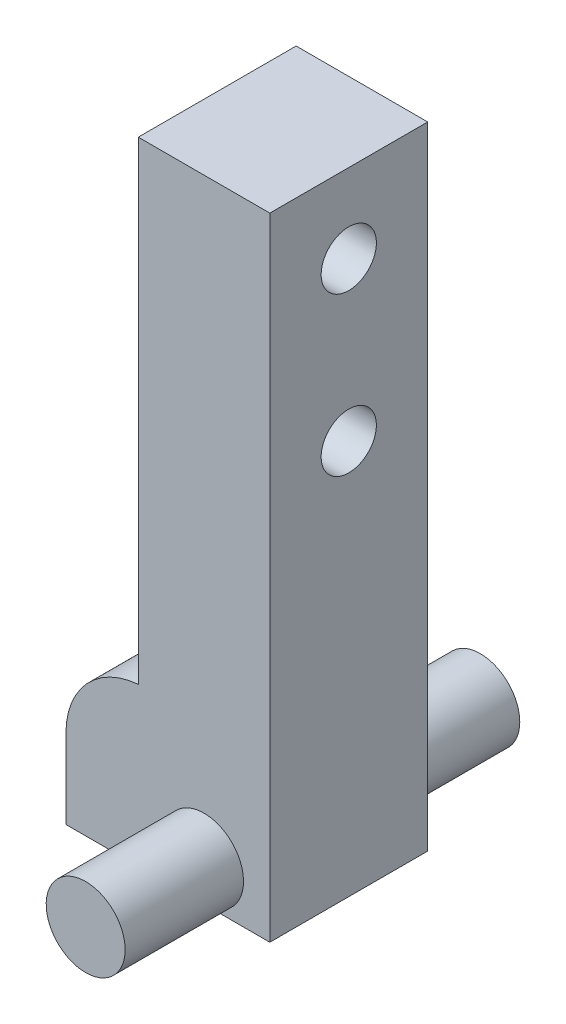
ISO-10303-21;
HEADER;
FILE_DESCRIPTION(('STEP AP214'),'2;1');
FILE_NAME('part.step','',(''),(''),'','','');
FILE_SCHEMA(('AUTOMOTIVE_DESIGN { 1 0 10303 214 1 1 1 1 }'));
ENDSEC;
DATA;
#1=APPLICATION_CONTEXT('core data for automotive mechanical design processes');
#2=APPLICATION_PROTOCOL_DEFINITION('international standard','automotive_design',2000,#1);
#3=PRODUCT_CONTEXT('',#1,'mechanical');
#4=PRODUCT('Part','Part','',(#3));
#5=PRODUCT_RELATED_PRODUCT_CATEGORY('part','',(#4));
#6=PRODUCT_DEFINITION_FORMATION('','',#4);
#7=PRODUCT_DEFINITION_CONTEXT('part definition',#1,'design');
#8=PRODUCT_DEFINITION('design','',#6,#7);
#9=PRODUCT_DEFINITION_SHAPE('','',#8);
#10=(LENGTH_UNIT() NAMED_UNIT(*) SI_UNIT(.MILLI.,.METRE.));
#11=(NAMED_UNIT(*) PLANE_ANGLE_UNIT() SI_UNIT($,.RADIAN.));
#12=(NAMED_UNIT(*) SI_UNIT($,.STERADIAN.) SOLID_ANGLE_UNIT());
#13=UNCERTAINTY_MEASURE_WITH_UNIT(LENGTH_MEASURE(1.E-05),#10,'distance_accuracy_value','');
#14=(GEOMETRIC_REPRESENTATION_CONTEXT(3) GLOBAL_UNCERTAINTY_ASSIGNED_CONTEXT((#13)) GLOBAL_UNIT_ASSIGNED_CONTEXT((#10,
#11,#12)) REPRESENTATION_CONTEXT('',''));
#15=CARTESIAN_POINT('',(0.,0.,0.));
#16=DIRECTION('',(0.,0.,1.));
#17=DIRECTION('',(1.,0.,0.));
#18=AXIS2_PLACEMENT_3D('',#15,#16,#17);
#19=CARTESIAN_POINT('',(0.,0.,12.));
#20=DIRECTION('',(-1.,0.,0.));
#21=DIRECTION('',(0.,-1.,0.));
#22=AXIS2_PLACEMENT_3D('',#19,#20,#21);
#23=PLANE('',#22);
#24=DIRECTION('',(0.,1.,0.));
#25=VECTOR('',#24,1.);
#26=CARTESIAN_POINT('',(0.,0.,0.));
#27=LINE('',#26,#25);
#28=CARTESIAN_POINT('',(0.,0.,0.));
#29=VERTEX_POINT('',#28);
#30=CARTESIAN_POINT('',(0.,48.,0.));
#31=VERTEX_POINT('',#30);
#32=EDGE_CURVE('E137',#29,#31,#27,.T.);
#33=ORIENTED_EDGE('',*,*,#32,.T.);
#34=DIRECTION('',(0.,0.,-1.));
#35=VECTOR('',#34,1.);
#36=CARTESIAN_POINT('',(0.,48.,12.));
#37=LINE('',#36,#35);
#38=CARTESIAN_POINT('',(0.,48.,12.));
#39=VERTEX_POINT('',#38);
#40=EDGE_CURVE('E119',#39,#31,#37,.T.);
#41=ORIENTED_EDGE('',*,*,#40,.F.);
#42=DIRECTION('',(0.,1.,0.));
#43=VECTOR('',#42,1.);
#44=CARTESIAN_POINT('',(0.,0.,12.));
#45=LINE('',#44,#43);
#46=CARTESIAN_POINT('',(0.,0.,12.));
#47=VERTEX_POINT('',#46);
#48=EDGE_CURVE('E107',#47,#39,#45,.T.);
#49=ORIENTED_EDGE('',*,*,#48,.F.);
#50=DIRECTION('',(0.,0.,-1.));
#51=VECTOR('',#50,1.);
#52=CARTESIAN_POINT('',(0.,0.,12.));
#53=LINE('',#52,#51);
#54=EDGE_CURVE('E44',#47,#29,#53,.T.);
#55=ORIENTED_EDGE('',*,*,#54,.T.);
#56=EDGE_LOOP('',(#33,#41,#49,#55));
#57=FACE_BOUND('',#56,.T.);
#58=CARTESIAN_POINT('',(0.,42.,6.));
#59=DIRECTION('',(-1.,0.,0.));
#60=DIRECTION('',(0.,-1.,0.));
#61=AXIS2_PLACEMENT_3D('',#58,#59,#60);
#62=CIRCLE('',#61,2.1);
#63=CARTESIAN_POINT('',(0.,39.9,6.));
#64=VERTEX_POINT('',#63);
#65=EDGE_CURVE('E219',#64,#64,#62,.F.);
#66=ORIENTED_EDGE('',*,*,#65,.F.);
#67=EDGE_LOOP('',(#66));
#68=FACE_BOUND('',#67,.T.);
#69=CARTESIAN_POINT('',(0.,30.,6.));
#70=DIRECTION('',(-1.,0.,0.));
#71=DIRECTION('',(0.,-1.,0.));
#72=AXIS2_PLACEMENT_3D('',#69,#70,#71);
#73=CIRCLE('',#72,2.1);
#74=CARTESIAN_POINT('',(0.,27.9,6.));
#75=VERTEX_POINT('',#74);
#76=EDGE_CURVE('E214',#75,#75,#73,.F.);
#77=ORIENTED_EDGE('',*,*,#76,.F.);
#78=EDGE_LOOP('',(#77));
#79=FACE_BOUND('',#78,.T.);
#80=ADVANCED_FACE('F35',(#57,#68,#79),#23,.F.);
#81=CARTESIAN_POINT('',(-10.,48.,12.));
#82=DIRECTION('',(1.,0.,0.));
#83=DIRECTION('',(0.,1.,0.));
#84=AXIS2_PLACEMENT_3D('',#81,#82,#83);
#85=PLANE('',#84);
#86=DIRECTION('',(0.,-1.,0.));
#87=VECTOR('',#86,1.);
#88=CARTESIAN_POINT('',(-10.,48.,0.));
#89=LINE('',#88,#87);
#90=CARTESIAN_POINT('',(-10.,48.,0.));
#91=VERTEX_POINT('',#90);
#92=CARTESIAN_POINT('',(-9.99999999999999,11.9791303715507,0.));
#93=VERTEX_POINT('',#92);
#94=EDGE_CURVE('E140',#91,#93,#89,.T.);
#95=ORIENTED_EDGE('',*,*,#94,.T.);
#96=DIRECTION('',(0.,0.,-1.));
#97=VECTOR('',#96,1.);
#98=CARTESIAN_POINT('',(-9.99999999999999,11.9791303715507,12.));
#99=LINE('',#98,#97);
#100=CARTESIAN_POINT('',(-9.99999999999999,11.9791303715507,12.));
#101=VERTEX_POINT('',#100);
#102=EDGE_CURVE('E120',#101,#93,#99,.T.);
#103=ORIENTED_EDGE('',*,*,#102,.F.);
#104=DIRECTION('',(0.,-1.,0.));
#105=VECTOR('',#104,1.);
#106=CARTESIAN_POINT('',(-10.,48.,12.));
#107=LINE('',#106,#105);
#108=CARTESIAN_POINT('',(-10.,48.,12.));
#109=VERTEX_POINT('',#108);
#110=EDGE_CURVE('E104',#109,#101,#107,.T.);
#111=ORIENTED_EDGE('',*,*,#110,.F.);
#112=DIRECTION('',(0.,0.,-1.));
#113=VECTOR('',#112,1.);
#114=CARTESIAN_POINT('',(-10.,48.,12.));
#115=LINE('',#114,#113);
#116=EDGE_CURVE('E113',#109,#91,#115,.T.);
#117=ORIENTED_EDGE('',*,*,#116,.T.);
#118=EDGE_LOOP('',(#95,#103,#111,#117));
#119=FACE_BOUND('',#118,.T.);
#120=CARTESIAN_POINT('',(-9.9999999999909,42.,6.));
#121=DIRECTION('',(-1.,0.,0.));
#122=DIRECTION('',(0.,0.,1.));
#123=AXIS2_PLACEMENT_3D('',#120,#121,#122);
#124=CIRCLE('',#123,2.1);
#125=CARTESIAN_POINT('',(-9.9999999999909,42.,8.1));
#126=VERTEX_POINT('',#125);
#127=EDGE_CURVE('E216',#126,#126,#124,.T.);
#128=ORIENTED_EDGE('',*,*,#127,.F.);
#129=EDGE_LOOP('',(#128));
#130=FACE_BOUND('',#129,.T.);
#131=CARTESIAN_POINT('',(-9.99999999999091,30.,6.));
#132=DIRECTION('',(-1.,0.,0.));
#133=DIRECTION('',(0.,0.,1.));
#134=AXIS2_PLACEMENT_3D('',#131,#132,#133);
#135=CIRCLE('',#134,2.1);
#136=CARTESIAN_POINT('',(-9.99999999999091,30.,8.1));
#137=VERTEX_POINT('',#136);
#138=EDGE_CURVE('E211',#137,#137,#135,.T.);
#139=ORIENTED_EDGE('',*,*,#138,.F.);
#140=EDGE_LOOP('',(#139));
#141=FACE_BOUND('',#140,.T.);
#142=ADVANCED_FACE('F122',(#119,#130,#141),#85,.F.);
#143=CARTESIAN_POINT('',(-15.5,6.,12.));
#144=DIRECTION('',(1.,0.,0.));
#145=DIRECTION('',(0.,0.,-1.));
#146=AXIS2_PLACEMENT_3D('',#143,#144,#145);
#147=PLANE('',#146);
#148=DIRECTION('',(0.,-1.,0.));
#149=VECTOR('',#148,1.);
#150=CARTESIAN_POINT('',(-15.5,6.,0.));
#151=LINE('',#150,#149);
#152=CARTESIAN_POINT('',(-15.5,6.,0.));
#153=VERTEX_POINT('',#152);
#154=CARTESIAN_POINT('',(-15.5,0.,0.));
#155=VERTEX_POINT('',#154);
#156=EDGE_CURVE('E129',#153,#155,#151,.T.);
#157=ORIENTED_EDGE('',*,*,#156,.T.);
#158=DIRECTION('',(0.,0.,-1.));
#159=VECTOR('',#158,1.);
#160=CARTESIAN_POINT('',(-15.5,0.,12.));
#161=LINE('',#160,#159);
#162=CARTESIAN_POINT('',(-15.5,0.,12.));
#163=VERTEX_POINT('',#162);
#164=EDGE_CURVE('E11',#163,#155,#161,.T.);
#165=ORIENTED_EDGE('',*,*,#164,.F.);
#166=DIRECTION('',(0.,-1.,0.));
#167=VECTOR('',#166,1.);
#168=CARTESIAN_POINT('',(-15.5,6.,12.));
#169=LINE('',#168,#167);
#170=CARTESIAN_POINT('',(-15.5,6.,12.));
#171=VERTEX_POINT('',#170);
#172=EDGE_CURVE('E143',#171,#163,#169,.T.);
#173=ORIENTED_EDGE('',*,*,#172,.F.);
#174=DIRECTION('',(0.,0.,-1.));
#175=VECTOR('',#174,1.);
#176=CARTESIAN_POINT('',(-15.5,6.,12.));
#177=LINE('',#176,#175);
#178=EDGE_CURVE('E125',#171,#153,#177,.T.);
#179=ORIENTED_EDGE('',*,*,#178,.T.);
#180=EDGE_LOOP('',(#157,#165,#173,#179));
#181=FACE_BOUND('',#180,.T.);
#182=ADVANCED_FACE('F37',(#181),#147,.F.);
#183=CARTESIAN_POINT('',(-15.5,0.,12.));
#184=DIRECTION('',(0.,1.,0.));
#185=DIRECTION('',(0.,0.,1.));
#186=AXIS2_PLACEMENT_3D('',#183,#184,#185);
#187=PLANE('',#186);
#188=DIRECTION('',(1.,0.,0.));
#189=VECTOR('',#188,1.);
#190=CARTESIAN_POINT('',(-15.5,0.,0.));
#191=LINE('',#190,#189);
#192=CARTESIAN_POINT('',(-5.,0.,0.));
#193=VERTEX_POINT('',#192);
#194=EDGE_CURVE('E134',#155,#193,#191,.T.);
#195=ORIENTED_EDGE('',*,*,#194,.T.);
#196=EDGE_CURVE('E132',#193,#29,#191,.T.);
#197=ORIENTED_EDGE('',*,*,#196,.T.);
#198=ORIENTED_EDGE('',*,*,#54,.F.);
#199=DIRECTION('',(1.,0.,0.));
#200=VECTOR('',#199,1.);
#201=CARTESIAN_POINT('',(-15.5,0.,12.));
#202=LINE('',#201,#200);
#203=CARTESIAN_POINT('',(-5.,0.,12.));
#204=VERTEX_POINT('',#203);
#205=EDGE_CURVE('E160',#204,#47,#202,.T.);
#206=ORIENTED_EDGE('',*,*,#205,.F.);
#207=EDGE_CURVE('E91',#163,#204,#202,.T.);
#208=ORIENTED_EDGE('',*,*,#207,.F.);
#209=ORIENTED_EDGE('',*,*,#164,.T.);
#210=EDGE_LOOP('',(#195,#197,#198,#206,#208,#209));
#211=FACE_BOUND('',#210,.T.);
#212=ADVANCED_FACE('F167',(#211),#187,.F.);
#213=CARTESIAN_POINT('',(0.,48.,12.));
#214=DIRECTION('',(0.,-1.,0.));
#215=DIRECTION('',(0.,0.,-1.));
#216=AXIS2_PLACEMENT_3D('',#213,#214,#215);
#217=PLANE('',#216);
#218=DIRECTION('',(-1.,0.,0.));
#219=VECTOR('',#218,1.);
#220=CARTESIAN_POINT('',(0.,48.,0.));
#221=LINE('',#220,#219);
#222=EDGE_CURVE('E116',#31,#91,#221,.T.);
#223=ORIENTED_EDGE('',*,*,#222,.T.);
#224=ORIENTED_EDGE('',*,*,#116,.F.);
#225=DIRECTION('',(-1.,0.,0.));
#226=VECTOR('',#225,1.);
#227=CARTESIAN_POINT('',(0.,48.,12.));
#228=LINE('',#227,#226);
#229=EDGE_CURVE('E100',#39,#109,#228,.T.);
#230=ORIENTED_EDGE('',*,*,#229,.F.);
#231=ORIENTED_EDGE('',*,*,#40,.T.);
#232=EDGE_LOOP('',(#223,#224,#230,#231));
#233=FACE_BOUND('',#232,.T.);
#234=ADVANCED_FACE('F114',(#233),#217,.F.);
#235=CARTESIAN_POINT('',(-9.5,6.,12.));
#236=DIRECTION('',(0.,0.,-1.));
#237=DIRECTION('',(-1.,0.,0.));
#238=AXIS2_PLACEMENT_3D('',#235,#236,#237);
#239=CYLINDRICAL_SURFACE('',#238,6.);
#240=CARTESIAN_POINT('',(-9.5,6.,0.));
#241=DIRECTION('',(0.,0.,1.));
#242=DIRECTION('',(-1.,0.,0.));
#243=AXIS2_PLACEMENT_3D('',#240,#241,#242);
#244=CIRCLE('',#243,6.);
#245=EDGE_CURVE('E83',#93,#153,#244,.T.);
#246=ORIENTED_EDGE('',*,*,#245,.T.);
#247=ORIENTED_EDGE('',*,*,#178,.F.);
#248=CARTESIAN_POINT('',(-9.5,6.,12.));
#249=DIRECTION('',(0.,0.,1.));
#250=DIRECTION('',(-1.,0.,0.));
#251=AXIS2_PLACEMENT_3D('',#248,#249,#250);
#252=CIRCLE('',#251,6.);
#253=EDGE_CURVE('E56',#101,#171,#252,.T.);
#254=ORIENTED_EDGE('',*,*,#253,.F.);
#255=ORIENTED_EDGE('',*,*,#102,.T.);
#256=EDGE_LOOP('',(#246,#247,#254,#255));
#257=FACE_BOUND('',#256,.T.);
#258=ADVANCED_FACE('F156',(#257),#239,.T.);
#259=CARTESIAN_POINT('',(-9.5,6.,12.));
#260=DIRECTION('',(0.,0.,-1.));
#261=DIRECTION('',(-1.,0.,0.));
#262=AXIS2_PLACEMENT_3D('',#259,#260,#261);
#263=PLANE('',#262);
#264=ORIENTED_EDGE('',*,*,#207,.T.);
#265=CARTESIAN_POINT('',(-5.,3.,12.));
#266=DIRECTION('',(0.,0.,-1.));
#267=DIRECTION('',(-1.,0.,0.));
#268=AXIS2_PLACEMENT_3D('',#265,#266,#267);
#269=CIRCLE('',#268,3.);
#270=EDGE_CURVE('E133',#204,#204,#269,.F.);
#271=ORIENTED_EDGE('',*,*,#270,.F.);
#272=ORIENTED_EDGE('',*,*,#205,.T.);
#273=ORIENTED_EDGE('',*,*,#48,.T.);
#274=ORIENTED_EDGE('',*,*,#229,.T.);
#275=ORIENTED_EDGE('',*,*,#110,.T.);
#276=ORIENTED_EDGE('',*,*,#253,.T.);
#277=ORIENTED_EDGE('',*,*,#172,.T.);
#278=EDGE_LOOP('',(#264,#271,#272,#273,#274,#275,#276,#277));
#279=FACE_BOUND('',#278,.T.);
#280=ADVANCED_FACE('F102',(#279),#263,.F.);
#281=CARTESIAN_POINT('',(-9.5,6.,0.));
#282=DIRECTION('',(0.,0.,-1.));
#283=DIRECTION('',(-1.,0.,0.));
#284=AXIS2_PLACEMENT_3D('',#281,#282,#283);
#285=PLANE('',#284);
#286=ORIENTED_EDGE('',*,*,#196,.F.);
#287=CARTESIAN_POINT('',(-5.,3.,0.));
#288=DIRECTION('',(0.,0.,-1.));
#289=DIRECTION('',(-1.,0.,0.));
#290=AXIS2_PLACEMENT_3D('',#287,#288,#289);
#291=CIRCLE('',#290,3.);
#292=EDGE_CURVE('E39',#193,#193,#291,.F.);
#293=ORIENTED_EDGE('',*,*,#292,.T.);
#294=ORIENTED_EDGE('',*,*,#194,.F.);
#295=ORIENTED_EDGE('',*,*,#156,.F.);
#296=ORIENTED_EDGE('',*,*,#245,.F.);
#297=ORIENTED_EDGE('',*,*,#94,.F.);
#298=ORIENTED_EDGE('',*,*,#222,.F.);
#299=ORIENTED_EDGE('',*,*,#32,.F.);
#300=EDGE_LOOP('',(#286,#293,#294,#295,#296,#297,#298,#299));
#301=FACE_BOUND('',#300,.T.);
#302=ADVANCED_FACE('F154',(#301),#285,.T.);
#303=CARTESIAN_POINT('',(-5.,3.,-9.));
#304=DIRECTION('',(0.,0.,1.));
#305=DIRECTION('',(1.,0.,0.));
#306=AXIS2_PLACEMENT_3D('',#303,#304,#305);
#307=PLANE('',#306);
#308=CARTESIAN_POINT('',(-5.,3.,-9.));
#309=DIRECTION('',(0.,0.,1.));
#310=DIRECTION('',(1.,0.,0.));
#311=AXIS2_PLACEMENT_3D('',#308,#309,#310);
#312=CIRCLE('',#311,3.);
#313=CARTESIAN_POINT('',(-2.,3.,-9.));
#314=VERTEX_POINT('',#313);
#315=EDGE_CURVE('E225',#314,#314,#312,.T.);
#316=ORIENTED_EDGE('',*,*,#315,.F.);
#317=EDGE_LOOP('',(#316));
#318=FACE_BOUND('',#317,.T.);
#319=ADVANCED_FACE('F185',(#318),#307,.F.);
#320=CARTESIAN_POINT('',(-5.,3.,21.));
#321=DIRECTION('',(0.,0.,-1.));
#322=DIRECTION('',(-1.,0.,0.));
#323=AXIS2_PLACEMENT_3D('',#320,#321,#322);
#324=CYLINDRICAL_SURFACE('',#323,3.);
#325=ORIENTED_EDGE('',*,*,#292,.F.);
#326=EDGE_LOOP('',(#325));
#327=FACE_BOUND('',#326,.T.);
#328=ORIENTED_EDGE('',*,*,#315,.T.);
#329=EDGE_LOOP('',(#328));
#330=FACE_BOUND('',#329,.T.);
#331=ADVANCED_FACE('F188',(#327,#330),#324,.T.);
#332=CARTESIAN_POINT('',(-5.,3.,21.));
#333=DIRECTION('',(0.,0.,1.));
#334=DIRECTION('',(1.,0.,0.));
#335=AXIS2_PLACEMENT_3D('',#332,#333,#334);
#336=CIRCLE('',#335,3.);
#337=CARTESIAN_POINT('',(-2.,3.,21.));
#338=VERTEX_POINT('',#337);
#339=EDGE_CURVE('E226',#338,#338,#336,.T.);
#340=ORIENTED_EDGE('',*,*,#339,.F.);
#341=EDGE_LOOP('',(#340));
#342=FACE_BOUND('',#341,.T.);
#343=ORIENTED_EDGE('',*,*,#270,.T.);
#344=EDGE_LOOP('',(#343));
#345=FACE_BOUND('',#344,.T.);
#346=ADVANCED_FACE('F191',(#342,#345),#324,.T.);
#347=CARTESIAN_POINT('',(-5.,3.,21.));
#348=DIRECTION('',(0.,0.,1.));
#349=DIRECTION('',(1.,0.,0.));
#350=AXIS2_PLACEMENT_3D('',#347,#348,#349);
#351=PLANE('',#350);
#352=ORIENTED_EDGE('',*,*,#339,.T.);
#353=EDGE_LOOP('',(#352));
#354=FACE_BOUND('',#353,.T.);
#355=ADVANCED_FACE('F195',(#354),#351,.T.);
#356=CARTESIAN_POINT('',(-9.9999999999909,42.,6.));
#357=DIRECTION('',(-1.,0.,0.));
#358=DIRECTION('',(0.,0.,1.));
#359=AXIS2_PLACEMENT_3D('',#356,#357,#358);
#360=CYLINDRICAL_SURFACE('',#359,2.1);
#361=ORIENTED_EDGE('',*,*,#127,.T.);
#362=EDGE_LOOP('',(#361));
#363=FACE_BOUND('',#362,.T.);
#364=ORIENTED_EDGE('',*,*,#65,.T.);
#365=EDGE_LOOP('',(#364));
#366=FACE_BOUND('',#365,.T.);
#367=ADVANCED_FACE('F198',(#363,#366),#360,.F.);
#368=CARTESIAN_POINT('',(-9.99999999999091,30.,6.));
#369=DIRECTION('',(-1.,0.,0.));
#370=DIRECTION('',(0.,0.,1.));
#371=AXIS2_PLACEMENT_3D('',#368,#369,#370);
#372=CYLINDRICAL_SURFACE('',#371,2.1);
#373=ORIENTED_EDGE('',*,*,#138,.T.);
#374=EDGE_LOOP('',(#373));
#375=FACE_BOUND('',#374,.T.);
#376=ORIENTED_EDGE('',*,*,#76,.T.);
#377=EDGE_LOOP('',(#376));
#378=FACE_BOUND('',#377,.T.);
#379=ADVANCED_FACE('F202',(#375,#378),#372,.F.);
#380=CLOSED_SHELL('',(#80,#142,#182,#212,#234,#258,#280,#302,#319,#331,#346,#355,#367,#379));
#381=MANIFOLD_SOLID_BREP('B2',#380);
#382=ADVANCED_BREP_SHAPE_REPRESENTATION('',(#18,#381),#14);
#383=SHAPE_DEFINITION_REPRESENTATION(#9,#382);
ENDSEC;
END-ISO-10303-21;
